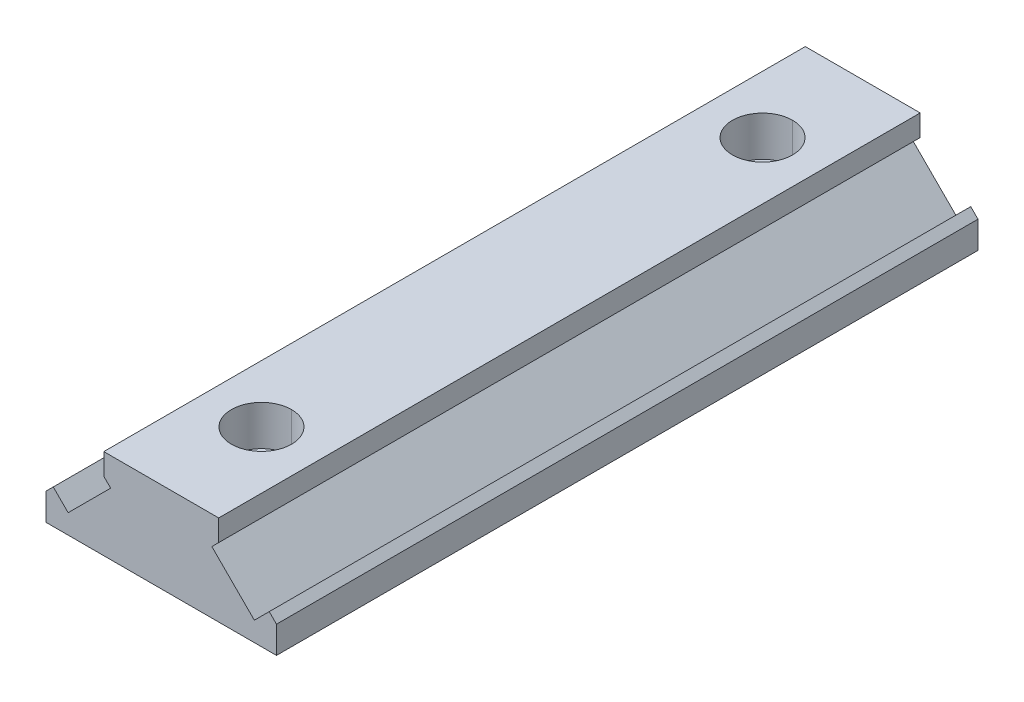
ISO-10303-21;
HEADER;
FILE_DESCRIPTION(('STEP AP214'),'2;1');
FILE_NAME('part.step','',(''),(''),'','','');
FILE_SCHEMA(('AUTOMOTIVE_DESIGN { 1 0 10303 214 1 1 1 1 }'));
ENDSEC;
DATA;
#1=APPLICATION_CONTEXT('core data for automotive mechanical design processes');
#2=APPLICATION_PROTOCOL_DEFINITION('international standard','automotive_design',2000,#1);
#3=PRODUCT_CONTEXT('',#1,'mechanical');
#4=PRODUCT('Part','Part','',(#3));
#5=PRODUCT_RELATED_PRODUCT_CATEGORY('part','',(#4));
#6=PRODUCT_DEFINITION_FORMATION('','',#4);
#7=PRODUCT_DEFINITION_CONTEXT('part definition',#1,'design');
#8=PRODUCT_DEFINITION('design','',#6,#7);
#9=PRODUCT_DEFINITION_SHAPE('','',#8);
#10=(LENGTH_UNIT() NAMED_UNIT(*) SI_UNIT(.MILLI.,.METRE.));
#11=(NAMED_UNIT(*) PLANE_ANGLE_UNIT() SI_UNIT($,.RADIAN.));
#12=(NAMED_UNIT(*) SI_UNIT($,.STERADIAN.) SOLID_ANGLE_UNIT());
#13=UNCERTAINTY_MEASURE_WITH_UNIT(LENGTH_MEASURE(1.E-05),#10,'distance_accuracy_value','');
#14=(GEOMETRIC_REPRESENTATION_CONTEXT(3) GLOBAL_UNCERTAINTY_ASSIGNED_CONTEXT((#13)) GLOBAL_UNIT_ASSIGNED_CONTEXT((#10,
#11,#12)) REPRESENTATION_CONTEXT('',''));
#15=CARTESIAN_POINT('',(0.,0.,0.));
#16=DIRECTION('',(0.,0.,1.));
#17=DIRECTION('',(1.,0.,0.));
#18=AXIS2_PLACEMENT_3D('',#15,#16,#17);
#19=CARTESIAN_POINT('',(-10.775735931288,3.4242640687119,70.));
#20=DIRECTION('',(0.7071067811865,-0.707106781186596,0.));
#21=DIRECTION('',(0.707106781186596,0.7071067811865,0.));
#22=AXIS2_PLACEMENT_3D('',#19,#20,#21);
#23=PLANE('',#22);
#24=DIRECTION('',(-0.707106781186596,-0.707106781186499,0.));
#25=VECTOR('',#24,1.);
#26=CARTESIAN_POINT('',(-10.775735931288,3.4242640687119,0.));
#27=LINE('',#26,#25);
#28=CARTESIAN_POINT('',(-10.775735931288,3.4242640687119,0.));
#29=VERTEX_POINT('',#28);
#30=CARTESIAN_POINT('',(-11.5,2.7,0.));
#31=VERTEX_POINT('',#30);
#32=EDGE_CURVE('E11',#29,#31,#27,.T.);
#33=ORIENTED_EDGE('',*,*,#32,.T.);
#34=DIRECTION('',(0.,0.,-1.));
#35=VECTOR('',#34,1.);
#36=CARTESIAN_POINT('',(-11.5,2.7,70.));
#37=LINE('',#36,#35);
#38=CARTESIAN_POINT('',(-11.5,2.7,70.));
#39=VERTEX_POINT('',#38);
#40=EDGE_CURVE('E24',#39,#31,#37,.T.);
#41=ORIENTED_EDGE('',*,*,#40,.F.);
#42=DIRECTION('',(-0.707106781186596,-0.707106781186499,0.));
#43=VECTOR('',#42,1.);
#44=CARTESIAN_POINT('',(-10.775735931288,3.4242640687119,70.));
#45=LINE('',#44,#43);
#46=CARTESIAN_POINT('',(-10.775735931288,3.4242640687119,70.));
#47=VERTEX_POINT('',#46);
#48=EDGE_CURVE('E460',#47,#39,#45,.T.);
#49=ORIENTED_EDGE('',*,*,#48,.F.);
#50=DIRECTION('',(0.,0.,-1.));
#51=VECTOR('',#50,1.);
#52=CARTESIAN_POINT('',(-10.775735931288,3.4242640687119,70.));
#53=LINE('',#52,#51);
#54=EDGE_CURVE('E456',#47,#29,#53,.T.);
#55=ORIENTED_EDGE('',*,*,#54,.T.);
#56=EDGE_LOOP('',(#33,#41,#49,#55));
#57=FACE_BOUND('',#56,.T.);
#58=ADVANCED_FACE('F16',(#57),#23,.F.);
#59=CARTESIAN_POINT('',(-9.2908116907963,1.9393398282202,70.));
#60=DIRECTION('',(-0.707106781186547,-0.707106781186548,0.));
#61=DIRECTION('',(0.707106781186548,-0.707106781186547,0.));
#62=AXIS2_PLACEMENT_3D('',#59,#60,#61);
#63=PLANE('',#62);
#64=DIRECTION('',(-0.707106781186548,0.707106781186547,0.));
#65=VECTOR('',#64,1.);
#66=CARTESIAN_POINT('',(-9.2908116907963,1.9393398282202,0.));
#67=LINE('',#66,#65);
#68=CARTESIAN_POINT('',(-9.2908116907963,1.9393398282202,0.));
#69=VERTEX_POINT('',#68);
#70=EDGE_CURVE('E451',#69,#29,#67,.T.);
#71=ORIENTED_EDGE('',*,*,#70,.T.);
#72=ORIENTED_EDGE('',*,*,#54,.F.);
#73=DIRECTION('',(-0.707106781186548,0.707106781186547,0.));
#74=VECTOR('',#73,1.);
#75=CARTESIAN_POINT('',(-9.2908116907963,1.9393398282202,70.));
#76=LINE('',#75,#74);
#77=CARTESIAN_POINT('',(-9.2908116907963,1.9393398282202,70.));
#78=VERTEX_POINT('',#77);
#79=EDGE_CURVE('E446',#78,#47,#76,.T.);
#80=ORIENTED_EDGE('',*,*,#79,.F.);
#81=DIRECTION('',(0.,0.,-1.));
#82=VECTOR('',#81,1.);
#83=CARTESIAN_POINT('',(-9.2908116907963,1.9393398282202,70.));
#84=LINE('',#83,#82);
#85=EDGE_CURVE('E442',#78,#69,#84,.T.);
#86=ORIENTED_EDGE('',*,*,#85,.T.);
#87=EDGE_LOOP('',(#71,#72,#80,#86));
#88=FACE_BOUND('',#87,.T.);
#89=ADVANCED_FACE('F478',(#88),#63,.F.);
#90=CARTESIAN_POINT('',(-5.048171003677,6.1819805153395,70.));
#91=DIRECTION('',(0.707106781186548,-0.707106781186548,0.));
#92=DIRECTION('',(0.707106781186548,0.707106781186548,0.));
#93=AXIS2_PLACEMENT_3D('',#90,#91,#92);
#94=PLANE('',#93);
#95=DIRECTION('',(-0.707106781186548,-0.707106781186548,0.));
#96=VECTOR('',#95,1.);
#97=CARTESIAN_POINT('',(-5.048171003677,6.1819805153395,0.));
#98=LINE('',#97,#96);
#99=CARTESIAN_POINT('',(-5.048171003677,6.1819805153395,0.));
#100=VERTEX_POINT('',#99);
#101=EDGE_CURVE('E437',#100,#69,#98,.T.);
#102=ORIENTED_EDGE('',*,*,#101,.T.);
#103=ORIENTED_EDGE('',*,*,#85,.F.);
#104=DIRECTION('',(-0.707106781186548,-0.707106781186548,0.));
#105=VECTOR('',#104,1.);
#106=CARTESIAN_POINT('',(-5.048171003677,6.1819805153395,70.));
#107=LINE('',#106,#105);
#108=CARTESIAN_POINT('',(-5.048171003677,6.1819805153395,70.));
#109=VERTEX_POINT('',#108);
#110=EDGE_CURVE('E432',#109,#78,#107,.T.);
#111=ORIENTED_EDGE('',*,*,#110,.F.);
#112=DIRECTION('',(0.,0.,-1.));
#113=VECTOR('',#112,1.);
#114=CARTESIAN_POINT('',(-5.048171003677,6.1819805153395,70.));
#115=LINE('',#114,#113);
#116=EDGE_CURVE('E428',#109,#100,#115,.T.);
#117=ORIENTED_EDGE('',*,*,#116,.T.);
#118=EDGE_LOOP('',(#102,#103,#111,#117));
#119=FACE_BOUND('',#118,.T.);
#120=ADVANCED_FACE('F523',(#119),#94,.F.);
#121=CARTESIAN_POINT('',(-5.7330952441688,6.8669047558312,70.));
#122=DIRECTION('',(0.707106781186496,0.707106781186599,0.));
#123=DIRECTION('',(-0.707106781186599,0.707106781186496,0.));
#124=AXIS2_PLACEMENT_3D('',#121,#122,#123);
#125=PLANE('',#124);
#126=DIRECTION('',(0.707106781186599,-0.707106781186496,0.));
#127=VECTOR('',#126,1.);
#128=CARTESIAN_POINT('',(-5.7330952441688,6.8669047558312,0.));
#129=LINE('',#128,#127);
#130=CARTESIAN_POINT('',(-5.7330952441688,6.8669047558312,0.));
#131=VERTEX_POINT('',#130);
#132=EDGE_CURVE('E423',#131,#100,#129,.T.);
#133=ORIENTED_EDGE('',*,*,#132,.T.);
#134=ORIENTED_EDGE('',*,*,#116,.F.);
#135=DIRECTION('',(0.707106781186599,-0.707106781186496,0.));
#136=VECTOR('',#135,1.);
#137=CARTESIAN_POINT('',(-5.7330952441688,6.8669047558312,70.));
#138=LINE('',#137,#136);
#139=CARTESIAN_POINT('',(-5.7330952441688,6.8669047558312,70.));
#140=VERTEX_POINT('',#139);
#141=EDGE_CURVE('E418',#140,#109,#138,.T.);
#142=ORIENTED_EDGE('',*,*,#141,.F.);
#143=DIRECTION('',(0.,0.,-1.));
#144=VECTOR('',#143,1.);
#145=CARTESIAN_POINT('',(-5.7330952441688,6.8669047558312,70.));
#146=LINE('',#145,#144);
#147=EDGE_CURVE('E414',#140,#131,#146,.T.);
#148=ORIENTED_EDGE('',*,*,#147,.T.);
#149=EDGE_LOOP('',(#133,#134,#142,#148));
#150=FACE_BOUND('',#149,.T.);
#151=ADVANCED_FACE('F520',(#150),#125,.F.);
#152=CARTESIAN_POINT('',(-5.7330952441688,9.,70.));
#153=DIRECTION('',(1.,0.,0.));
#154=DIRECTION('',(0.,0.,-1.));
#155=AXIS2_PLACEMENT_3D('',#152,#153,#154);
#156=PLANE('',#155);
#157=DIRECTION('',(0.,-1.,0.));
#158=VECTOR('',#157,1.);
#159=CARTESIAN_POINT('',(-5.7330952441688,9.,0.));
#160=LINE('',#159,#158);
#161=CARTESIAN_POINT('',(-5.7330952441688,9.,0.));
#162=VERTEX_POINT('',#161);
#163=EDGE_CURVE('E409',#162,#131,#160,.T.);
#164=ORIENTED_EDGE('',*,*,#163,.T.);
#165=ORIENTED_EDGE('',*,*,#147,.F.);
#166=DIRECTION('',(0.,-1.,0.));
#167=VECTOR('',#166,1.);
#168=CARTESIAN_POINT('',(-5.7330952441688,9.,70.));
#169=LINE('',#168,#167);
#170=CARTESIAN_POINT('',(-5.7330952441688,9.,70.));
#171=VERTEX_POINT('',#170);
#172=EDGE_CURVE('E404',#171,#140,#169,.T.);
#173=ORIENTED_EDGE('',*,*,#172,.F.);
#174=DIRECTION('',(0.,0.,-1.));
#175=VECTOR('',#174,1.);
#176=CARTESIAN_POINT('',(-5.7330952441688,9.,70.));
#177=LINE('',#176,#175);
#178=EDGE_CURVE('E400',#171,#162,#177,.T.);
#179=ORIENTED_EDGE('',*,*,#178,.T.);
#180=EDGE_LOOP('',(#164,#165,#173,#179));
#181=FACE_BOUND('',#180,.T.);
#182=ADVANCED_FACE('F517',(#181),#156,.F.);
#183=CARTESIAN_POINT('',(5.7330952441688,9.,70.));
#184=DIRECTION('',(0.,-1.,0.));
#185=DIRECTION('',(0.,0.,-1.));
#186=AXIS2_PLACEMENT_3D('',#183,#184,#185);
#187=PLANE('',#186);
#188=CARTESIAN_POINT('',(0.,9.,60.));
#189=DIRECTION('',(0.,-1.,0.));
#190=DIRECTION('',(0.,0.,-1.));
#191=AXIS2_PLACEMENT_3D('',#188,#189,#190);
#192=CIRCLE('',#191,3.);
#193=CARTESIAN_POINT('',(0.,9.,57.));
#194=VERTEX_POINT('',#193);
#195=CARTESIAN_POINT('',(0.,9.,63.));
#196=VERTEX_POINT('',#195);
#197=EDGE_CURVE('E174',#194,#196,#192,.T.);
#198=ORIENTED_EDGE('',*,*,#197,.T.);
#199=CARTESIAN_POINT('',(0.,9.,60.));
#200=DIRECTION('',(0.,-1.,0.));
#201=DIRECTION('',(0.,0.,-1.));
#202=AXIS2_PLACEMENT_3D('',#199,#200,#201);
#203=CIRCLE('',#202,3.);
#204=EDGE_CURVE('E393',#196,#194,#203,.T.);
#205=ORIENTED_EDGE('',*,*,#204,.T.);
#206=EDGE_LOOP('',(#198,#205));
#207=FACE_BOUND('',#206,.T.);
#208=CARTESIAN_POINT('',(0.,9.,10.));
#209=DIRECTION('',(0.,-1.,0.));
#210=DIRECTION('',(0.,0.,-1.));
#211=AXIS2_PLACEMENT_3D('',#208,#209,#210);
#212=CIRCLE('',#211,3.);
#213=CARTESIAN_POINT('',(0.,9.,7.));
#214=VERTEX_POINT('',#213);
#215=CARTESIAN_POINT('',(0.,9.,13.));
#216=VERTEX_POINT('',#215);
#217=EDGE_CURVE('E389',#214,#216,#212,.T.);
#218=ORIENTED_EDGE('',*,*,#217,.T.);
#219=CARTESIAN_POINT('',(0.,9.,10.));
#220=DIRECTION('',(0.,-1.,0.));
#221=DIRECTION('',(0.,0.,-1.));
#222=AXIS2_PLACEMENT_3D('',#219,#220,#221);
#223=CIRCLE('',#222,3.);
#224=EDGE_CURVE('E385',#216,#214,#223,.T.);
#225=ORIENTED_EDGE('',*,*,#224,.T.);
#226=EDGE_LOOP('',(#218,#225));
#227=FACE_BOUND('',#226,.T.);
#228=DIRECTION('',(-1.,0.,0.));
#229=VECTOR('',#228,1.);
#230=CARTESIAN_POINT('',(5.7330952441688,9.,0.));
#231=LINE('',#230,#229);
#232=CARTESIAN_POINT('',(5.7330952441688,9.,0.));
#233=VERTEX_POINT('',#232);
#234=EDGE_CURVE('E380',#233,#162,#231,.T.);
#235=ORIENTED_EDGE('',*,*,#234,.T.);
#236=ORIENTED_EDGE('',*,*,#178,.F.);
#237=DIRECTION('',(-1.,0.,0.));
#238=VECTOR('',#237,1.);
#239=CARTESIAN_POINT('',(5.7330952441688,9.,70.));
#240=LINE('',#239,#238);
#241=CARTESIAN_POINT('',(5.7330952441688,9.,70.));
#242=VERTEX_POINT('',#241);
#243=EDGE_CURVE('E375',#242,#171,#240,.T.);
#244=ORIENTED_EDGE('',*,*,#243,.F.);
#245=DIRECTION('',(0.,0.,-1.));
#246=VECTOR('',#245,1.);
#247=CARTESIAN_POINT('',(5.7330952441688,9.,70.));
#248=LINE('',#247,#246);
#249=EDGE_CURVE('E371',#242,#233,#248,.T.);
#250=ORIENTED_EDGE('',*,*,#249,.T.);
#251=EDGE_LOOP('',(#235,#236,#244,#250));
#252=FACE_BOUND('',#251,.T.);
#253=ADVANCED_FACE('F514',(#207,#227,#252),#187,.F.);
#254=CARTESIAN_POINT('',(5.7330952441688,6.8669047558312,70.));
#255=DIRECTION('',(-1.,0.,0.));
#256=DIRECTION('',(0.,0.,1.));
#257=AXIS2_PLACEMENT_3D('',#254,#255,#256);
#258=PLANE('',#257);
#259=DIRECTION('',(0.,1.,0.));
#260=VECTOR('',#259,1.);
#261=CARTESIAN_POINT('',(5.7330952441688,6.8669047558312,0.));
#262=LINE('',#261,#260);
#263=CARTESIAN_POINT('',(5.7330952441688,6.8669047558312,0.));
#264=VERTEX_POINT('',#263);
#265=EDGE_CURVE('E366',#264,#233,#262,.T.);
#266=ORIENTED_EDGE('',*,*,#265,.T.);
#267=ORIENTED_EDGE('',*,*,#249,.F.);
#268=DIRECTION('',(0.,1.,0.));
#269=VECTOR('',#268,1.);
#270=CARTESIAN_POINT('',(5.7330952441688,6.8669047558312,70.));
#271=LINE('',#270,#269);
#272=CARTESIAN_POINT('',(5.7330952441688,6.8669047558312,70.));
#273=VERTEX_POINT('',#272);
#274=EDGE_CURVE('E361',#273,#242,#271,.T.);
#275=ORIENTED_EDGE('',*,*,#274,.F.);
#276=DIRECTION('',(0.,0.,-1.));
#277=VECTOR('',#276,1.);
#278=CARTESIAN_POINT('',(5.7330952441688,6.8669047558312,70.));
#279=LINE('',#278,#277);
#280=EDGE_CURVE('E357',#273,#264,#279,.T.);
#281=ORIENTED_EDGE('',*,*,#280,.T.);
#282=EDGE_LOOP('',(#266,#267,#275,#281));
#283=FACE_BOUND('',#282,.T.);
#284=ADVANCED_FACE('F508',(#283),#258,.F.);
#285=CARTESIAN_POINT('',(5.048171003677,6.1819805153395,70.));
#286=DIRECTION('',(-0.707106781186496,0.707106781186599,0.));
#287=DIRECTION('',(-0.707106781186599,-0.707106781186496,0.));
#288=AXIS2_PLACEMENT_3D('',#285,#286,#287);
#289=PLANE('',#288);
#290=DIRECTION('',(0.707106781186599,0.707106781186496,0.));
#291=VECTOR('',#290,1.);
#292=CARTESIAN_POINT('',(5.048171003677,6.1819805153395,0.));
#293=LINE('',#292,#291);
#294=CARTESIAN_POINT('',(5.048171003677,6.1819805153395,0.));
#295=VERTEX_POINT('',#294);
#296=EDGE_CURVE('E352',#295,#264,#293,.T.);
#297=ORIENTED_EDGE('',*,*,#296,.T.);
#298=ORIENTED_EDGE('',*,*,#280,.F.);
#299=DIRECTION('',(0.707106781186599,0.707106781186496,0.));
#300=VECTOR('',#299,1.);
#301=CARTESIAN_POINT('',(5.048171003677,6.1819805153395,70.));
#302=LINE('',#301,#300);
#303=CARTESIAN_POINT('',(5.048171003677,6.1819805153395,70.));
#304=VERTEX_POINT('',#303);
#305=EDGE_CURVE('E347',#304,#273,#302,.T.);
#306=ORIENTED_EDGE('',*,*,#305,.F.);
#307=DIRECTION('',(0.,0.,-1.));
#308=VECTOR('',#307,1.);
#309=CARTESIAN_POINT('',(5.048171003677,6.1819805153395,70.));
#310=LINE('',#309,#308);
#311=EDGE_CURVE('E343',#304,#295,#310,.T.);
#312=ORIENTED_EDGE('',*,*,#311,.T.);
#313=EDGE_LOOP('',(#297,#298,#306,#312));
#314=FACE_BOUND('',#313,.T.);
#315=ADVANCED_FACE('F505',(#314),#289,.F.);
#316=CARTESIAN_POINT('',(9.2908116907963,1.9393398282202,70.));
#317=DIRECTION('',(-0.707106781186548,-0.707106781186548,0.));
#318=DIRECTION('',(0.707106781186548,-0.707106781186548,0.));
#319=AXIS2_PLACEMENT_3D('',#316,#317,#318);
#320=PLANE('',#319);
#321=DIRECTION('',(-0.707106781186548,0.707106781186548,0.));
#322=VECTOR('',#321,1.);
#323=CARTESIAN_POINT('',(9.2908116907963,1.9393398282202,0.));
#324=LINE('',#323,#322);
#325=CARTESIAN_POINT('',(9.2908116907963,1.9393398282202,0.));
#326=VERTEX_POINT('',#325);
#327=EDGE_CURVE('E338',#326,#295,#324,.T.);
#328=ORIENTED_EDGE('',*,*,#327,.T.);
#329=ORIENTED_EDGE('',*,*,#311,.F.);
#330=DIRECTION('',(-0.707106781186548,0.707106781186548,0.));
#331=VECTOR('',#330,1.);
#332=CARTESIAN_POINT('',(9.2908116907963,1.9393398282202,70.));
#333=LINE('',#332,#331);
#334=CARTESIAN_POINT('',(9.2908116907963,1.9393398282202,70.));
#335=VERTEX_POINT('',#334);
#336=EDGE_CURVE('E333',#335,#304,#333,.T.);
#337=ORIENTED_EDGE('',*,*,#336,.F.);
#338=DIRECTION('',(0.,0.,-1.));
#339=VECTOR('',#338,1.);
#340=CARTESIAN_POINT('',(9.2908116907963,1.9393398282202,70.));
#341=LINE('',#340,#339);
#342=EDGE_CURVE('E329',#335,#326,#341,.T.);
#343=ORIENTED_EDGE('',*,*,#342,.T.);
#344=EDGE_LOOP('',(#328,#329,#337,#343));
#345=FACE_BOUND('',#344,.T.);
#346=ADVANCED_FACE('F502',(#345),#320,.F.);
#347=CARTESIAN_POINT('',(10.775735931288,3.4242640687119,70.));
#348=DIRECTION('',(0.707106781186547,-0.707106781186548,0.));
#349=DIRECTION('',(0.707106781186548,0.707106781186547,0.));
#350=AXIS2_PLACEMENT_3D('',#347,#348,#349);
#351=PLANE('',#350);
#352=DIRECTION('',(-0.707106781186548,-0.707106781186547,0.));
#353=VECTOR('',#352,1.);
#354=CARTESIAN_POINT('',(10.775735931288,3.4242640687119,0.));
#355=LINE('',#354,#353);
#356=CARTESIAN_POINT('',(10.775735931288,3.4242640687119,0.));
#357=VERTEX_POINT('',#356);
#358=EDGE_CURVE('E324',#357,#326,#355,.T.);
#359=ORIENTED_EDGE('',*,*,#358,.T.);
#360=ORIENTED_EDGE('',*,*,#342,.F.);
#361=DIRECTION('',(-0.707106781186548,-0.707106781186547,0.));
#362=VECTOR('',#361,1.);
#363=CARTESIAN_POINT('',(10.775735931288,3.4242640687119,70.));
#364=LINE('',#363,#362);
#365=CARTESIAN_POINT('',(10.775735931288,3.4242640687119,70.));
#366=VERTEX_POINT('',#365);
#367=EDGE_CURVE('E319',#366,#335,#364,.T.);
#368=ORIENTED_EDGE('',*,*,#367,.F.);
#369=DIRECTION('',(0.,0.,-1.));
#370=VECTOR('',#369,1.);
#371=CARTESIAN_POINT('',(10.775735931288,3.4242640687119,70.));
#372=LINE('',#371,#370);
#373=EDGE_CURVE('E315',#366,#357,#372,.T.);
#374=ORIENTED_EDGE('',*,*,#373,.T.);
#375=EDGE_LOOP('',(#359,#360,#368,#374));
#376=FACE_BOUND('',#375,.T.);
#377=ADVANCED_FACE('F496',(#376),#351,.F.);
#378=CARTESIAN_POINT('',(11.5,2.7,70.));
#379=DIRECTION('',(-0.7071067811865,-0.707106781186596,0.));
#380=DIRECTION('',(0.707106781186596,-0.7071067811865,0.));
#381=AXIS2_PLACEMENT_3D('',#378,#379,#380);
#382=PLANE('',#381);
#383=DIRECTION('',(-0.707106781186596,0.707106781186499,0.));
#384=VECTOR('',#383,1.);
#385=CARTESIAN_POINT('',(11.5,2.7,0.));
#386=LINE('',#385,#384);
#387=CARTESIAN_POINT('',(11.5,2.7,0.));
#388=VERTEX_POINT('',#387);
#389=EDGE_CURVE('E310',#388,#357,#386,.T.);
#390=ORIENTED_EDGE('',*,*,#389,.T.);
#391=ORIENTED_EDGE('',*,*,#373,.F.);
#392=DIRECTION('',(-0.707106781186596,0.707106781186499,0.));
#393=VECTOR('',#392,1.);
#394=CARTESIAN_POINT('',(11.5,2.7,70.));
#395=LINE('',#394,#393);
#396=CARTESIAN_POINT('',(11.5,2.7,70.));
#397=VERTEX_POINT('',#396);
#398=EDGE_CURVE('E305',#397,#366,#395,.T.);
#399=ORIENTED_EDGE('',*,*,#398,.F.);
#400=DIRECTION('',(0.,0.,-1.));
#401=VECTOR('',#400,1.);
#402=CARTESIAN_POINT('',(11.5,2.7,70.));
#403=LINE('',#402,#401);
#404=EDGE_CURVE('E301',#397,#388,#403,.T.);
#405=ORIENTED_EDGE('',*,*,#404,.T.);
#406=EDGE_LOOP('',(#390,#391,#399,#405));
#407=FACE_BOUND('',#406,.T.);
#408=ADVANCED_FACE('F493',(#407),#382,.F.);
#409=CARTESIAN_POINT('',(11.5,0.,70.));
#410=DIRECTION('',(-1.,0.,0.));
#411=DIRECTION('',(0.,0.,1.));
#412=AXIS2_PLACEMENT_3D('',#409,#410,#411);
#413=PLANE('',#412);
#414=DIRECTION('',(0.,1.,0.));
#415=VECTOR('',#414,1.);
#416=CARTESIAN_POINT('',(11.5,0.,0.));
#417=LINE('',#416,#415);
#418=CARTESIAN_POINT('',(11.5,0.,0.));
#419=VERTEX_POINT('',#418);
#420=EDGE_CURVE('E296',#419,#388,#417,.T.);
#421=ORIENTED_EDGE('',*,*,#420,.T.);
#422=ORIENTED_EDGE('',*,*,#404,.F.);
#423=DIRECTION('',(0.,1.,0.));
#424=VECTOR('',#423,1.);
#425=CARTESIAN_POINT('',(11.5,0.,70.));
#426=LINE('',#425,#424);
#427=CARTESIAN_POINT('',(11.5,0.,70.));
#428=VERTEX_POINT('',#427);
#429=EDGE_CURVE('E291',#428,#397,#426,.T.);
#430=ORIENTED_EDGE('',*,*,#429,.F.);
#431=DIRECTION('',(0.,0.,-1.));
#432=VECTOR('',#431,1.);
#433=CARTESIAN_POINT('',(11.5,0.,70.));
#434=LINE('',#433,#432);
#435=EDGE_CURVE('E287',#428,#419,#434,.T.);
#436=ORIENTED_EDGE('',*,*,#435,.T.);
#437=EDGE_LOOP('',(#421,#422,#430,#436));
#438=FACE_BOUND('',#437,.T.);
#439=ADVANCED_FACE('F491',(#438),#413,.F.);
#440=CARTESIAN_POINT('',(-11.5,0.,70.));
#441=DIRECTION('',(0.,1.,0.));
#442=DIRECTION('',(0.,0.,1.));
#443=AXIS2_PLACEMENT_3D('',#440,#441,#442);
#444=PLANE('',#443);
#445=CARTESIAN_POINT('',(0.,0.,60.));
#446=DIRECTION('',(0.,-1.,0.));
#447=DIRECTION('',(0.,0.,-1.));
#448=AXIS2_PLACEMENT_3D('',#445,#446,#447);
#449=CIRCLE('',#448,1.75);
#450=CARTESIAN_POINT('',(0.,0.,61.75));
#451=VERTEX_POINT('',#450);
#452=CARTESIAN_POINT('',(0.,0.,58.25));
#453=VERTEX_POINT('',#452);
#454=EDGE_CURVE('E282',#451,#453,#449,.T.);
#455=ORIENTED_EDGE('',*,*,#454,.F.);
#456=CARTESIAN_POINT('',(0.,0.,60.));
#457=DIRECTION('',(0.,-1.,0.));
#458=DIRECTION('',(0.,0.,-1.));
#459=AXIS2_PLACEMENT_3D('',#456,#457,#458);
#460=CIRCLE('',#459,1.75);
#461=EDGE_CURVE('E277',#453,#451,#460,.T.);
#462=ORIENTED_EDGE('',*,*,#461,.F.);
#463=EDGE_LOOP('',(#455,#462));
#464=FACE_BOUND('',#463,.T.);
#465=CARTESIAN_POINT('',(0.,0.,10.));
#466=DIRECTION('',(0.,-1.,0.));
#467=DIRECTION('',(0.,0.,-1.));
#468=AXIS2_PLACEMENT_3D('',#465,#466,#467);
#469=CIRCLE('',#468,1.75);
#470=CARTESIAN_POINT('',(0.,0.,11.75));
#471=VERTEX_POINT('',#470);
#472=CARTESIAN_POINT('',(0.,0.,8.25));
#473=VERTEX_POINT('',#472);
#474=EDGE_CURVE('E272',#471,#473,#469,.T.);
#475=ORIENTED_EDGE('',*,*,#474,.F.);
#476=CARTESIAN_POINT('',(0.,0.,10.));
#477=DIRECTION('',(0.,-1.,0.));
#478=DIRECTION('',(0.,0.,-1.));
#479=AXIS2_PLACEMENT_3D('',#476,#477,#478);
#480=CIRCLE('',#479,1.75);
#481=EDGE_CURVE('E267',#473,#471,#480,.T.);
#482=ORIENTED_EDGE('',*,*,#481,.F.);
#483=EDGE_LOOP('',(#475,#482));
#484=FACE_BOUND('',#483,.T.);
#485=DIRECTION('',(1.,0.,0.));
#486=VECTOR('',#485,1.);
#487=CARTESIAN_POINT('',(-11.5,0.,0.));
#488=LINE('',#487,#486);
#489=CARTESIAN_POINT('',(-11.5,0.,0.));
#490=VERTEX_POINT('',#489);
#491=EDGE_CURVE('E262',#490,#419,#488,.T.);
#492=ORIENTED_EDGE('',*,*,#491,.T.);
#493=ORIENTED_EDGE('',*,*,#435,.F.);
#494=DIRECTION('',(1.,0.,0.));
#495=VECTOR('',#494,1.);
#496=CARTESIAN_POINT('',(-11.5,0.,70.));
#497=LINE('',#496,#495);
#498=CARTESIAN_POINT('',(-11.5,0.,70.));
#499=VERTEX_POINT('',#498);
#500=EDGE_CURVE('E257',#499,#428,#497,.T.);
#501=ORIENTED_EDGE('',*,*,#500,.F.);
#502=DIRECTION('',(0.,0.,-1.));
#503=VECTOR('',#502,1.);
#504=CARTESIAN_POINT('',(-11.5,0.,70.));
#505=LINE('',#504,#503);
#506=EDGE_CURVE('E253',#499,#490,#505,.T.);
#507=ORIENTED_EDGE('',*,*,#506,.T.);
#508=EDGE_LOOP('',(#492,#493,#501,#507));
#509=FACE_BOUND('',#508,.T.);
#510=ADVANCED_FACE('F487',(#464,#484,#509),#444,.F.);
#511=CARTESIAN_POINT('',(-11.5,2.7,70.));
#512=DIRECTION('',(1.,0.,0.));
#513=DIRECTION('',(0.,0.,-1.));
#514=AXIS2_PLACEMENT_3D('',#511,#512,#513);
#515=PLANE('',#514);
#516=DIRECTION('',(0.,-1.,0.));
#517=VECTOR('',#516,1.);
#518=CARTESIAN_POINT('',(-11.5,2.7,0.));
#519=LINE('',#518,#517);
#520=EDGE_CURVE('E248',#31,#490,#519,.T.);
#521=ORIENTED_EDGE('',*,*,#520,.T.);
#522=ORIENTED_EDGE('',*,*,#506,.F.);
#523=DIRECTION('',(0.,-1.,0.));
#524=VECTOR('',#523,1.);
#525=CARTESIAN_POINT('',(-11.5,2.7,70.));
#526=LINE('',#525,#524);
#527=EDGE_CURVE('E243',#39,#499,#526,.T.);
#528=ORIENTED_EDGE('',*,*,#527,.F.);
#529=ORIENTED_EDGE('',*,*,#40,.T.);
#530=EDGE_LOOP('',(#521,#522,#528,#529));
#531=FACE_BOUND('',#530,.T.);
#532=ADVANCED_FACE('F470',(#531),#515,.F.);
#533=CARTESIAN_POINT('',(0.,0.,70.));
#534=DIRECTION('',(0.,0.,-1.));
#535=DIRECTION('',(-1.,0.,0.));
#536=AXIS2_PLACEMENT_3D('',#533,#534,#535);
#537=PLANE('',#536);
#538=ORIENTED_EDGE('',*,*,#48,.T.);
#539=ORIENTED_EDGE('',*,*,#527,.T.);
#540=ORIENTED_EDGE('',*,*,#500,.T.);
#541=ORIENTED_EDGE('',*,*,#429,.T.);
#542=ORIENTED_EDGE('',*,*,#398,.T.);
#543=ORIENTED_EDGE('',*,*,#367,.T.);
#544=ORIENTED_EDGE('',*,*,#336,.T.);
#545=ORIENTED_EDGE('',*,*,#305,.T.);
#546=ORIENTED_EDGE('',*,*,#274,.T.);
#547=ORIENTED_EDGE('',*,*,#243,.T.);
#548=ORIENTED_EDGE('',*,*,#172,.T.);
#549=ORIENTED_EDGE('',*,*,#141,.T.);
#550=ORIENTED_EDGE('',*,*,#110,.T.);
#551=ORIENTED_EDGE('',*,*,#79,.T.);
#552=EDGE_LOOP('',(#538,#539,#540,#541,#542,#543,#544,#545,#546,#547,#548,#549,#550,#551));
#553=FACE_BOUND('',#552,.T.);
#554=ADVANCED_FACE('F474',(#553),#537,.F.);
#555=CARTESIAN_POINT('',(0.,0.,0.));
#556=DIRECTION('',(0.,0.,-1.));
#557=DIRECTION('',(-1.,0.,0.));
#558=AXIS2_PLACEMENT_3D('',#555,#556,#557);
#559=PLANE('',#558);
#560=ORIENTED_EDGE('',*,*,#32,.F.);
#561=ORIENTED_EDGE('',*,*,#70,.F.);
#562=ORIENTED_EDGE('',*,*,#101,.F.);
#563=ORIENTED_EDGE('',*,*,#132,.F.);
#564=ORIENTED_EDGE('',*,*,#163,.F.);
#565=ORIENTED_EDGE('',*,*,#234,.F.);
#566=ORIENTED_EDGE('',*,*,#265,.F.);
#567=ORIENTED_EDGE('',*,*,#296,.F.);
#568=ORIENTED_EDGE('',*,*,#327,.F.);
#569=ORIENTED_EDGE('',*,*,#358,.F.);
#570=ORIENTED_EDGE('',*,*,#389,.F.);
#571=ORIENTED_EDGE('',*,*,#420,.F.);
#572=ORIENTED_EDGE('',*,*,#491,.F.);
#573=ORIENTED_EDGE('',*,*,#520,.F.);
#574=EDGE_LOOP('',(#560,#561,#562,#563,#564,#565,#566,#567,#568,#569,#570,#571,#572,#573));
#575=FACE_BOUND('',#574,.T.);
#576=ADVANCED_FACE('F482',(#575),#559,.T.);
#577=CARTESIAN_POINT('',(0.,0.,10.));
#578=DIRECTION('',(0.,-1.,0.));
#579=DIRECTION('',(-1.,0.,0.));
#580=AXIS2_PLACEMENT_3D('',#577,#578,#579);
#581=CYLINDRICAL_SURFACE('',#580,1.75);
#582=DIRECTION('',(0.,-1.,0.));
#583=VECTOR('',#582,1.);
#584=CARTESIAN_POINT('',(0.,5.,11.75));
#585=LINE('',#584,#583);
#586=CARTESIAN_POINT('',(0.,5.,11.75));
#587=VERTEX_POINT('',#586);
#588=EDGE_CURVE('E238',#587,#471,#585,.T.);
#589=ORIENTED_EDGE('',*,*,#588,.F.);
#590=CARTESIAN_POINT('',(0.,5.,10.));
#591=DIRECTION('',(0.,-1.,0.));
#592=DIRECTION('',(0.,0.,-1.));
#593=AXIS2_PLACEMENT_3D('',#590,#591,#592);
#594=CIRCLE('',#593,1.75);
#595=CARTESIAN_POINT('',(0.,5.,8.25));
#596=VERTEX_POINT('',#595);
#597=EDGE_CURVE('E233',#596,#587,#594,.T.);
#598=ORIENTED_EDGE('',*,*,#597,.F.);
#599=DIRECTION('',(0.,-1.,0.));
#600=VECTOR('',#599,1.);
#601=CARTESIAN_POINT('',(0.,5.,8.25));
#602=LINE('',#601,#600);
#603=EDGE_CURVE('E228',#596,#473,#602,.T.);
#604=ORIENTED_EDGE('',*,*,#603,.T.);
#605=ORIENTED_EDGE('',*,*,#481,.T.);
#606=EDGE_LOOP('',(#589,#598,#604,#605));
#607=FACE_BOUND('',#606,.T.);
#608=ADVANCED_FACE('F668',(#607),#581,.F.);
#609=CARTESIAN_POINT('',(0.,0.,10.));
#610=DIRECTION('',(0.,-1.,0.));
#611=DIRECTION('',(1.,0.,0.));
#612=AXIS2_PLACEMENT_3D('',#609,#610,#611);
#613=CYLINDRICAL_SURFACE('',#612,1.75);
#614=ORIENTED_EDGE('',*,*,#588,.T.);
#615=ORIENTED_EDGE('',*,*,#474,.T.);
#616=ORIENTED_EDGE('',*,*,#603,.F.);
#617=CARTESIAN_POINT('',(0.,5.,10.));
#618=DIRECTION('',(0.,-1.,0.));
#619=DIRECTION('',(0.,0.,-1.));
#620=AXIS2_PLACEMENT_3D('',#617,#618,#619);
#621=CIRCLE('',#620,1.75);
#622=EDGE_CURVE('E223',#587,#596,#621,.T.);
#623=ORIENTED_EDGE('',*,*,#622,.F.);
#624=EDGE_LOOP('',(#614,#615,#616,#623));
#625=FACE_BOUND('',#624,.T.);
#626=ADVANCED_FACE('F678',(#625),#613,.F.);
#627=CARTESIAN_POINT('',(3.,5.,10.));
#628=DIRECTION('',(0.,1.,0.));
#629=DIRECTION('',(0.,0.,1.));
#630=AXIS2_PLACEMENT_3D('',#627,#628,#629);
#631=PLANE('',#630);
#632=ORIENTED_EDGE('',*,*,#597,.T.);
#633=ORIENTED_EDGE('',*,*,#622,.T.);
#634=EDGE_LOOP('',(#632,#633));
#635=FACE_BOUND('',#634,.T.);
#636=CARTESIAN_POINT('',(0.,5.,10.));
#637=DIRECTION('',(0.,-1.,0.));
#638=DIRECTION('',(0.,0.,-1.));
#639=AXIS2_PLACEMENT_3D('',#636,#637,#638);
#640=CIRCLE('',#639,3.);
#641=CARTESIAN_POINT('',(0.,5.,13.));
#642=VERTEX_POINT('',#641);
#643=CARTESIAN_POINT('',(0.,5.,7.));
#644=VERTEX_POINT('',#643);
#645=EDGE_CURVE('E218',#642,#644,#640,.T.);
#646=ORIENTED_EDGE('',*,*,#645,.F.);
#647=CARTESIAN_POINT('',(0.,5.,10.));
#648=DIRECTION('',(0.,-1.,0.));
#649=DIRECTION('',(0.,0.,-1.));
#650=AXIS2_PLACEMENT_3D('',#647,#648,#649);
#651=CIRCLE('',#650,3.);
#652=EDGE_CURVE('E213',#644,#642,#651,.T.);
#653=ORIENTED_EDGE('',*,*,#652,.F.);
#654=EDGE_LOOP('',(#646,#653));
#655=FACE_BOUND('',#654,.T.);
#656=ADVANCED_FACE('F689',(#635,#655),#631,.T.);
#657=CARTESIAN_POINT('',(0.,0.,10.));
#658=DIRECTION('',(0.,-1.,0.));
#659=DIRECTION('',(-1.,0.,0.));
#660=AXIS2_PLACEMENT_3D('',#657,#658,#659);
#661=CYLINDRICAL_SURFACE('',#660,3.);
#662=DIRECTION('',(0.,-1.,0.));
#663=VECTOR('',#662,1.);
#664=CARTESIAN_POINT('',(0.,9.,13.));
#665=LINE('',#664,#663);
#666=EDGE_CURVE('E208',#216,#642,#665,.T.);
#667=ORIENTED_EDGE('',*,*,#666,.F.);
#668=ORIENTED_EDGE('',*,*,#217,.F.);
#669=DIRECTION('',(0.,-1.,0.));
#670=VECTOR('',#669,1.);
#671=CARTESIAN_POINT('',(0.,9.,7.));
#672=LINE('',#671,#670);
#673=EDGE_CURVE('E203',#214,#644,#672,.T.);
#674=ORIENTED_EDGE('',*,*,#673,.T.);
#675=ORIENTED_EDGE('',*,*,#652,.T.);
#676=EDGE_LOOP('',(#667,#668,#674,#675));
#677=FACE_BOUND('',#676,.T.);
#678=ADVANCED_FACE('F700',(#677),#661,.F.);
#679=CARTESIAN_POINT('',(0.,0.,10.));
#680=DIRECTION('',(0.,-1.,0.));
#681=DIRECTION('',(1.,0.,0.));
#682=AXIS2_PLACEMENT_3D('',#679,#680,#681);
#683=CYLINDRICAL_SURFACE('',#682,3.);
#684=ORIENTED_EDGE('',*,*,#666,.T.);
#685=ORIENTED_EDGE('',*,*,#645,.T.);
#686=ORIENTED_EDGE('',*,*,#673,.F.);
#687=ORIENTED_EDGE('',*,*,#224,.F.);
#688=EDGE_LOOP('',(#684,#685,#686,#687));
#689=FACE_BOUND('',#688,.T.);
#690=ADVANCED_FACE('F711',(#689),#683,.F.);
#691=CARTESIAN_POINT('',(0.,0.,60.));
#692=DIRECTION('',(0.,-1.,0.));
#693=DIRECTION('',(-1.,0.,0.));
#694=AXIS2_PLACEMENT_3D('',#691,#692,#693);
#695=CYLINDRICAL_SURFACE('',#694,1.75);
#696=DIRECTION('',(0.,-1.,0.));
#697=VECTOR('',#696,1.);
#698=CARTESIAN_POINT('',(0.,5.,61.75));
#699=LINE('',#698,#697);
#700=CARTESIAN_POINT('',(0.,5.,61.75));
#701=VERTEX_POINT('',#700);
#702=EDGE_CURVE('E198',#701,#451,#699,.T.);
#703=ORIENTED_EDGE('',*,*,#702,.F.);
#704=CARTESIAN_POINT('',(0.,5.,60.));
#705=DIRECTION('',(0.,-1.,0.));
#706=DIRECTION('',(0.,0.,-1.));
#707=AXIS2_PLACEMENT_3D('',#704,#705,#706);
#708=CIRCLE('',#707,1.75);
#709=CARTESIAN_POINT('',(0.,5.,58.25));
#710=VERTEX_POINT('',#709);
#711=EDGE_CURVE('E193',#710,#701,#708,.T.);
#712=ORIENTED_EDGE('',*,*,#711,.F.);
#713=DIRECTION('',(0.,-1.,0.));
#714=VECTOR('',#713,1.);
#715=CARTESIAN_POINT('',(0.,5.,58.25));
#716=LINE('',#715,#714);
#717=EDGE_CURVE('E182',#710,#453,#716,.T.);
#718=ORIENTED_EDGE('',*,*,#717,.T.);
#719=ORIENTED_EDGE('',*,*,#461,.T.);
#720=EDGE_LOOP('',(#703,#712,#718,#719));
#721=FACE_BOUND('',#720,.T.);
#722=ADVANCED_FACE('F722',(#721),#695,.F.);
#723=CARTESIAN_POINT('',(0.,0.,60.));
#724=DIRECTION('',(0.,-1.,0.));
#725=DIRECTION('',(1.,0.,0.));
#726=AXIS2_PLACEMENT_3D('',#723,#724,#725);
#727=CYLINDRICAL_SURFACE('',#726,1.75);
#728=ORIENTED_EDGE('',*,*,#702,.T.);
#729=ORIENTED_EDGE('',*,*,#454,.T.);
#730=ORIENTED_EDGE('',*,*,#717,.F.);
#731=CARTESIAN_POINT('',(0.,5.,60.));
#732=DIRECTION('',(0.,-1.,0.));
#733=DIRECTION('',(0.,0.,-1.));
#734=AXIS2_PLACEMENT_3D('',#731,#732,#733);
#735=CIRCLE('',#734,1.75);
#736=EDGE_CURVE('E179',#701,#710,#735,.T.);
#737=ORIENTED_EDGE('',*,*,#736,.F.);
#738=EDGE_LOOP('',(#728,#729,#730,#737));
#739=FACE_BOUND('',#738,.T.);
#740=ADVANCED_FACE('F733',(#739),#727,.F.);
#741=CARTESIAN_POINT('',(3.,5.,60.));
#742=DIRECTION('',(0.,1.,0.));
#743=DIRECTION('',(0.,0.,1.));
#744=AXIS2_PLACEMENT_3D('',#741,#742,#743);
#745=PLANE('',#744);
#746=ORIENTED_EDGE('',*,*,#711,.T.);
#747=ORIENTED_EDGE('',*,*,#736,.T.);
#748=EDGE_LOOP('',(#746,#747));
#749=FACE_BOUND('',#748,.T.);
#750=CARTESIAN_POINT('',(0.,5.,60.));
#751=DIRECTION('',(0.,-1.,0.));
#752=DIRECTION('',(0.,0.,-1.));
#753=AXIS2_PLACEMENT_3D('',#750,#751,#752);
#754=CIRCLE('',#753,3.);
#755=CARTESIAN_POINT('',(0.,5.,63.));
#756=VERTEX_POINT('',#755);
#757=CARTESIAN_POINT('',(0.,5.,57.));
#758=VERTEX_POINT('',#757);
#759=EDGE_CURVE('E164',#756,#758,#754,.T.);
#760=ORIENTED_EDGE('',*,*,#759,.F.);
#761=CARTESIAN_POINT('',(0.,5.,60.));
#762=DIRECTION('',(0.,-1.,0.));
#763=DIRECTION('',(0.,0.,-1.));
#764=AXIS2_PLACEMENT_3D('',#761,#762,#763);
#765=CIRCLE('',#764,3.);
#766=EDGE_CURVE('E160',#758,#756,#765,.T.);
#767=ORIENTED_EDGE('',*,*,#766,.F.);
#768=EDGE_LOOP('',(#760,#767));
#769=FACE_BOUND('',#768,.T.);
#770=ADVANCED_FACE('F162',(#749,#769),#745,.T.);
#771=CARTESIAN_POINT('',(0.,0.,60.));
#772=DIRECTION('',(0.,-1.,0.));
#773=DIRECTION('',(-1.,0.,0.));
#774=AXIS2_PLACEMENT_3D('',#771,#772,#773);
#775=CYLINDRICAL_SURFACE('',#774,3.);
#776=DIRECTION('',(0.,-1.,0.));
#777=VECTOR('',#776,1.);
#778=CARTESIAN_POINT('',(0.,9.,63.));
#779=LINE('',#778,#777);
#780=EDGE_CURVE('E168',#196,#756,#779,.T.);
#781=ORIENTED_EDGE('',*,*,#780,.F.);
#782=ORIENTED_EDGE('',*,*,#197,.F.);
#783=DIRECTION('',(0.,-1.,0.));
#784=VECTOR('',#783,1.);
#785=CARTESIAN_POINT('',(0.,9.,57.));
#786=LINE('',#785,#784);
#787=EDGE_CURVE('E172',#194,#758,#786,.T.);
#788=ORIENTED_EDGE('',*,*,#787,.T.);
#789=ORIENTED_EDGE('',*,*,#766,.T.);
#790=EDGE_LOOP('',(#781,#782,#788,#789));
#791=FACE_BOUND('',#790,.T.);
#792=ADVANCED_FACE('F173',(#791),#775,.F.);
#793=CARTESIAN_POINT('',(0.,0.,60.));
#794=DIRECTION('',(0.,-1.,0.));
#795=DIRECTION('',(1.,0.,0.));
#796=AXIS2_PLACEMENT_3D('',#793,#794,#795);
#797=CYLINDRICAL_SURFACE('',#796,3.);
#798=ORIENTED_EDGE('',*,*,#780,.T.);
#799=ORIENTED_EDGE('',*,*,#759,.T.);
#800=ORIENTED_EDGE('',*,*,#787,.F.);
#801=ORIENTED_EDGE('',*,*,#204,.F.);
#802=EDGE_LOOP('',(#798,#799,#800,#801));
#803=FACE_BOUND('',#802,.T.);
#804=ADVANCED_FACE('F178',(#803),#797,.F.);
#805=CLOSED_SHELL('',(#58,#89,#120,#151,#182,#253,#284,#315,#346,#377,#408,#439,#510,#532,#554,
#576,#608,#626,#656,#678,#690,#722,#740,#770,#792,#804));
#806=MANIFOLD_SOLID_BREP('B1',#805);
#807=ADVANCED_BREP_SHAPE_REPRESENTATION('',(#18,#806),#14);
#808=SHAPE_DEFINITION_REPRESENTATION(#9,#807);
ENDSEC;
END-ISO-10303-21;
